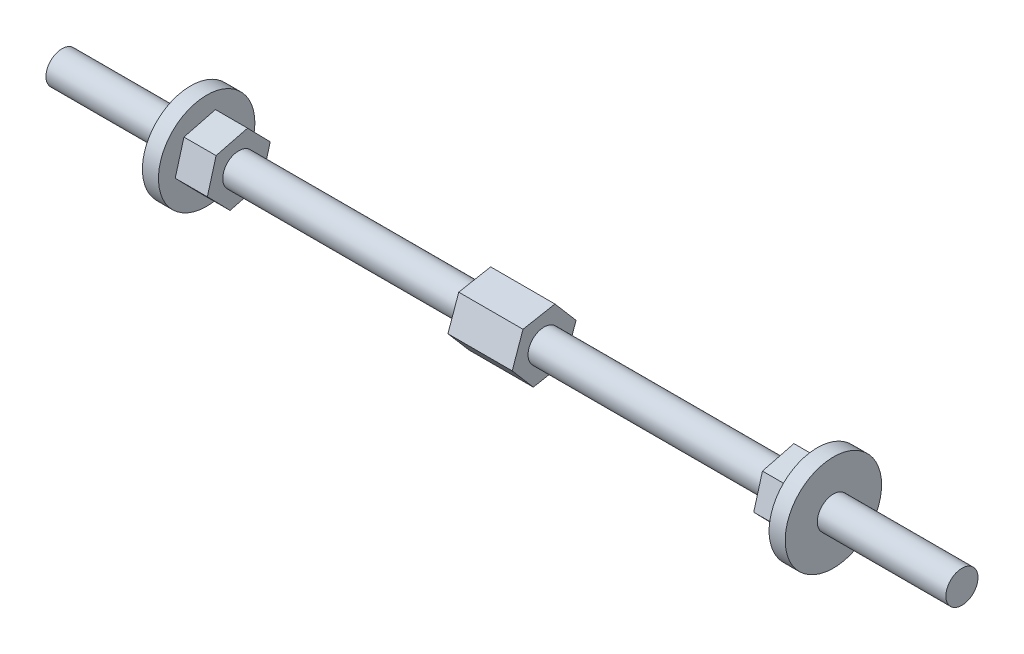
ISO-10303-21;
HEADER;
FILE_DESCRIPTION(('STEP AP214'),'2;1');
FILE_NAME('part.step','',(''),(''),'','','');
FILE_SCHEMA(('AUTOMOTIVE_DESIGN { 1 0 10303 214 1 1 1 1 }'));
ENDSEC;
DATA;
#1=APPLICATION_CONTEXT('core data for automotive mechanical design processes');
#2=APPLICATION_PROTOCOL_DEFINITION('international standard','automotive_design',2000,#1);
#3=PRODUCT_CONTEXT('',#1,'mechanical');
#4=PRODUCT('Part','Part','',(#3));
#5=PRODUCT_RELATED_PRODUCT_CATEGORY('part','',(#4));
#6=PRODUCT_DEFINITION_FORMATION('','',#4);
#7=PRODUCT_DEFINITION_CONTEXT('part definition',#1,'design');
#8=PRODUCT_DEFINITION('design','',#6,#7);
#9=PRODUCT_DEFINITION_SHAPE('','',#8);
#10=(LENGTH_UNIT() NAMED_UNIT(*) SI_UNIT(.MILLI.,.METRE.));
#11=(NAMED_UNIT(*) PLANE_ANGLE_UNIT() SI_UNIT($,.RADIAN.));
#12=(NAMED_UNIT(*) SI_UNIT($,.STERADIAN.) SOLID_ANGLE_UNIT());
#13=UNCERTAINTY_MEASURE_WITH_UNIT(LENGTH_MEASURE(1.E-05),#10,'distance_accuracy_value','');
#14=(GEOMETRIC_REPRESENTATION_CONTEXT(3) GLOBAL_UNCERTAINTY_ASSIGNED_CONTEXT((#13)) GLOBAL_UNIT_ASSIGNED_CONTEXT((#10,
#11,#12)) REPRESENTATION_CONTEXT('',''));
#15=CARTESIAN_POINT('',(0.,0.,0.));
#16=DIRECTION('',(0.,0.,1.));
#17=DIRECTION('',(1.,0.,0.));
#18=AXIS2_PLACEMENT_3D('',#15,#16,#17);
#19=CARTESIAN_POINT('',(-6.35,-6.0497679994844,2.13608502540229));
#20=DIRECTION('',(0.,-0.983087144735073,-0.183138378983327));
#21=DIRECTION('',(0.,0.183138378983327,-0.983087144735074));
#22=AXIS2_PLACEMENT_3D('',#19,#20,#21);
#23=PLANE('',#22);
#24=DIRECTION('',(1.,0.,0.));
#25=VECTOR('',#24,1.);
#26=CARTESIAN_POINT('',(-6.35,-4.87478789638411,-4.17121026185451));
#27=LINE('',#26,#25);
#28=CARTESIAN_POINT('',(-6.35,-4.87478789638411,-4.17121026185451));
#29=VERTEX_POINT('',#28);
#30=CARTESIAN_POINT('',(6.35,-4.87478789638411,-4.17121026185451));
#31=VERTEX_POINT('',#30);
#32=EDGE_CURVE('E381',#29,#31,#27,.T.);
#33=ORIENTED_EDGE('',*,*,#32,.T.);
#34=DIRECTION('',(0.,0.183138378983327,-0.983087144735073));
#35=VECTOR('',#34,1.);
#36=CARTESIAN_POINT('',(6.35,-6.0497679994844,2.13608502540229));
#37=LINE('',#36,#35);
#38=CARTESIAN_POINT('',(6.35,-6.0497679994844,2.13608502540229));
#39=VERTEX_POINT('',#38);
#40=EDGE_CURVE('E336',#39,#31,#37,.T.);
#41=ORIENTED_EDGE('',*,*,#40,.F.);
#42=DIRECTION('',(1.,0.,0.));
#43=VECTOR('',#42,1.);
#44=CARTESIAN_POINT('',(-6.35,-6.0497679994844,2.13608502540229));
#45=LINE('',#44,#43);
#46=CARTESIAN_POINT('',(-6.35,-6.0497679994844,2.13608502540229));
#47=VERTEX_POINT('',#46);
#48=EDGE_CURVE('E57',#47,#39,#45,.T.);
#49=ORIENTED_EDGE('',*,*,#48,.F.);
#50=DIRECTION('',(0.,0.183138378983327,-0.983087144735073));
#51=VECTOR('',#50,1.);
#52=CARTESIAN_POINT('',(-6.35,-6.0497679994844,2.13608502540229));
#53=LINE('',#52,#51);
#54=EDGE_CURVE('E360',#47,#29,#53,.T.);
#55=ORIENTED_EDGE('',*,*,#54,.T.);
#56=EDGE_LOOP('',(#33,#41,#49,#55));
#57=FACE_BOUND('',#56,.T.);
#58=ADVANCED_FACE('F41',(#57),#23,.T.);
#59=CARTESIAN_POINT('',(-6.35,-1.17498010310029,6.30729528725679));
#60=DIRECTION('',(0.,-0.650146060975,0.759809251982819));
#61=DIRECTION('',(0.,-0.759809251982819,-0.650146060975));
#62=AXIS2_PLACEMENT_3D('',#59,#60,#61);
#63=PLANE('',#62);
#64=ORIENTED_EDGE('',*,*,#48,.T.);
#65=DIRECTION('',(0.,-0.759809251982819,-0.650146060975));
#66=VECTOR('',#65,1.);
#67=CARTESIAN_POINT('',(6.35,-1.17498010310029,6.30729528725679));
#68=LINE('',#67,#66);
#69=CARTESIAN_POINT('',(6.35,-1.17498010310029,6.30729528725679));
#70=VERTEX_POINT('',#69);
#71=EDGE_CURVE('E356',#70,#39,#68,.T.);
#72=ORIENTED_EDGE('',*,*,#71,.F.);
#73=DIRECTION('',(1.,0.,0.));
#74=VECTOR('',#73,1.);
#75=CARTESIAN_POINT('',(-6.35,-1.17498010310029,6.30729528725679));
#76=LINE('',#75,#74);
#77=CARTESIAN_POINT('',(-6.35,-1.17498010310029,6.30729528725679));
#78=VERTEX_POINT('',#77);
#79=EDGE_CURVE('E65',#78,#70,#76,.T.);
#80=ORIENTED_EDGE('',*,*,#79,.F.);
#81=DIRECTION('',(0.,-0.759809251982819,-0.650146060975));
#82=VECTOR('',#81,1.);
#83=CARTESIAN_POINT('',(-6.35,-1.17498010310029,6.30729528725679));
#84=LINE('',#83,#82);
#85=EDGE_CURVE('E378',#78,#47,#84,.T.);
#86=ORIENTED_EDGE('',*,*,#85,.T.);
#87=EDGE_LOOP('',(#64,#72,#80,#86));
#88=FACE_BOUND('',#87,.T.);
#89=ADVANCED_FACE('F403',(#88),#63,.T.);
#90=CARTESIAN_POINT('',(-6.35,4.87478789638411,4.17121026185451));
#91=DIRECTION('',(0.,0.332941083760074,0.942947630966146));
#92=DIRECTION('',(0.,-0.942947630966146,0.332941083760074));
#93=AXIS2_PLACEMENT_3D('',#90,#91,#92);
#94=PLANE('',#93);
#95=ORIENTED_EDGE('',*,*,#79,.T.);
#96=DIRECTION('',(0.,-0.942947630966146,0.332941083760074));
#97=VECTOR('',#96,1.);
#98=CARTESIAN_POINT('',(6.35,4.87478789638411,4.17121026185451));
#99=LINE('',#98,#97);
#100=CARTESIAN_POINT('',(6.35,4.87478789638411,4.17121026185451));
#101=VERTEX_POINT('',#100);
#102=EDGE_CURVE('E352',#101,#70,#99,.T.);
#103=ORIENTED_EDGE('',*,*,#102,.F.);
#104=DIRECTION('',(1.,0.,0.));
#105=VECTOR('',#104,1.);
#106=CARTESIAN_POINT('',(-6.35,4.87478789638411,4.17121026185451));
#107=LINE('',#106,#105);
#108=CARTESIAN_POINT('',(-6.35,4.87478789638411,4.17121026185451));
#109=VERTEX_POINT('',#108);
#110=EDGE_CURVE('E386',#109,#101,#107,.T.);
#111=ORIENTED_EDGE('',*,*,#110,.F.);
#112=DIRECTION('',(0.,-0.942947630966146,0.332941083760074));
#113=VECTOR('',#112,1.);
#114=CARTESIAN_POINT('',(-6.35,4.87478789638411,4.17121026185451));
#115=LINE('',#114,#113);
#116=EDGE_CURVE('E375',#109,#78,#115,.T.);
#117=ORIENTED_EDGE('',*,*,#116,.T.);
#118=EDGE_LOOP('',(#95,#103,#111,#117));
#119=FACE_BOUND('',#118,.T.);
#120=ADVANCED_FACE('F416',(#119),#94,.T.);
#121=CARTESIAN_POINT('',(-6.35,6.0497679994844,-2.13608502540229));
#122=DIRECTION('',(0.,0.983087144735074,0.183138378983327));
#123=DIRECTION('',(0.,-0.183138378983327,0.983087144735074));
#124=AXIS2_PLACEMENT_3D('',#121,#122,#123);
#125=PLANE('',#124);
#126=ORIENTED_EDGE('',*,*,#110,.T.);
#127=DIRECTION('',(0.,-0.183138378983327,0.983087144735074));
#128=VECTOR('',#127,1.);
#129=CARTESIAN_POINT('',(6.35,6.0497679994844,-2.13608502540229));
#130=LINE('',#129,#128);
#131=CARTESIAN_POINT('',(6.35,6.0497679994844,-2.13608502540229));
#132=VERTEX_POINT('',#131);
#133=EDGE_CURVE('E348',#132,#101,#130,.T.);
#134=ORIENTED_EDGE('',*,*,#133,.F.);
#135=DIRECTION('',(1.,0.,0.));
#136=VECTOR('',#135,1.);
#137=CARTESIAN_POINT('',(-6.35,6.0497679994844,-2.13608502540229));
#138=LINE('',#137,#136);
#139=CARTESIAN_POINT('',(-6.35,6.0497679994844,-2.13608502540229));
#140=VERTEX_POINT('',#139);
#141=EDGE_CURVE('E389',#140,#132,#138,.T.);
#142=ORIENTED_EDGE('',*,*,#141,.F.);
#143=DIRECTION('',(0.,-0.183138378983327,0.983087144735074));
#144=VECTOR('',#143,1.);
#145=CARTESIAN_POINT('',(-6.35,6.0497679994844,-2.13608502540229));
#146=LINE('',#145,#144);
#147=EDGE_CURVE('E371',#140,#109,#146,.T.);
#148=ORIENTED_EDGE('',*,*,#147,.T.);
#149=EDGE_LOOP('',(#126,#134,#142,#148));
#150=FACE_BOUND('',#149,.T.);
#151=ADVANCED_FACE('F414',(#150),#125,.T.);
#152=CARTESIAN_POINT('',(-6.35,1.17498010310029,-6.30729528725679));
#153=DIRECTION('',(0.,0.650146060975,-0.759809251982819));
#154=DIRECTION('',(0.,0.759809251982819,0.650146060975));
#155=AXIS2_PLACEMENT_3D('',#152,#153,#154);
#156=PLANE('',#155);
#157=ORIENTED_EDGE('',*,*,#141,.T.);
#158=DIRECTION('',(0.,0.759809251982819,0.650146060975));
#159=VECTOR('',#158,1.);
#160=CARTESIAN_POINT('',(6.35,1.17498010310029,-6.30729528725679));
#161=LINE('',#160,#159);
#162=CARTESIAN_POINT('',(6.35,1.17498010310029,-6.30729528725679));
#163=VERTEX_POINT('',#162);
#164=EDGE_CURVE('E344',#163,#132,#161,.T.);
#165=ORIENTED_EDGE('',*,*,#164,.F.);
#166=DIRECTION('',(1.,0.,0.));
#167=VECTOR('',#166,1.);
#168=CARTESIAN_POINT('',(-6.35,1.17498010310029,-6.30729528725679));
#169=LINE('',#168,#167);
#170=CARTESIAN_POINT('',(-6.35,1.17498010310029,-6.30729528725679));
#171=VERTEX_POINT('',#170);
#172=EDGE_CURVE('E392',#171,#163,#169,.T.);
#173=ORIENTED_EDGE('',*,*,#172,.F.);
#174=DIRECTION('',(0.,0.759809251982819,0.650146060975));
#175=VECTOR('',#174,1.);
#176=CARTESIAN_POINT('',(-6.35,1.17498010310029,-6.30729528725679));
#177=LINE('',#176,#175);
#178=EDGE_CURVE('E367',#171,#140,#177,.T.);
#179=ORIENTED_EDGE('',*,*,#178,.T.);
#180=EDGE_LOOP('',(#157,#165,#173,#179));
#181=FACE_BOUND('',#180,.T.);
#182=ADVANCED_FACE('F411',(#181),#156,.T.);
#183=CARTESIAN_POINT('',(-6.35,-4.87478789638411,-4.17121026185451));
#184=DIRECTION('',(0.,-0.332941083760073,-0.942947630966146));
#185=DIRECTION('',(0.,0.942947630966146,-0.332941083760074));
#186=AXIS2_PLACEMENT_3D('',#183,#184,#185);
#187=PLANE('',#186);
#188=ORIENTED_EDGE('',*,*,#172,.T.);
#189=DIRECTION('',(0.,0.942947630966146,-0.332941083760073));
#190=VECTOR('',#189,1.);
#191=CARTESIAN_POINT('',(6.35,-4.87478789638411,-4.17121026185451));
#192=LINE('',#191,#190);
#193=EDGE_CURVE('E340',#31,#163,#192,.T.);
#194=ORIENTED_EDGE('',*,*,#193,.F.);
#195=ORIENTED_EDGE('',*,*,#32,.F.);
#196=DIRECTION('',(0.,0.942947630966146,-0.332941083760073));
#197=VECTOR('',#196,1.);
#198=CARTESIAN_POINT('',(-6.35,-4.87478789638411,-4.17121026185451));
#199=LINE('',#198,#197);
#200=EDGE_CURVE('E363',#29,#171,#199,.T.);
#201=ORIENTED_EDGE('',*,*,#200,.T.);
#202=EDGE_LOOP('',(#188,#194,#195,#201));
#203=FACE_BOUND('',#202,.T.);
#204=ADVANCED_FACE('F398',(#203),#187,.T.);
#205=CARTESIAN_POINT('',(-6.35,0.,0.));
#206=DIRECTION('',(1.,0.,0.));
#207=DIRECTION('',(0.,0.,-1.));
#208=AXIS2_PLACEMENT_3D('',#205,#206,#207);
#209=PLANE('',#208);
#210=CARTESIAN_POINT('',(-6.35,0.,0.));
#211=DIRECTION('',(1.,0.,0.));
#212=DIRECTION('',(0.,0.,-1.));
#213=AXIS2_PLACEMENT_3D('',#210,#211,#212);
#214=CIRCLE('',#213,3.175);
#215=CARTESIAN_POINT('',(-6.35,0.,-3.175));
#216=VERTEX_POINT('',#215);
#217=EDGE_CURVE('E329',#216,#216,#214,.T.);
#218=ORIENTED_EDGE('',*,*,#217,.T.);
#219=EDGE_LOOP('',(#218));
#220=FACE_BOUND('',#219,.T.);
#221=ORIENTED_EDGE('',*,*,#54,.F.);
#222=ORIENTED_EDGE('',*,*,#85,.F.);
#223=ORIENTED_EDGE('',*,*,#116,.F.);
#224=ORIENTED_EDGE('',*,*,#147,.F.);
#225=ORIENTED_EDGE('',*,*,#178,.F.);
#226=ORIENTED_EDGE('',*,*,#200,.F.);
#227=EDGE_LOOP('',(#221,#222,#223,#224,#225,#226));
#228=FACE_BOUND('',#227,.T.);
#229=ADVANCED_FACE('F407',(#220,#228),#209,.F.);
#230=CARTESIAN_POINT('',(6.35,0.,0.));
#231=DIRECTION('',(1.,0.,0.));
#232=DIRECTION('',(0.,0.,-1.));
#233=AXIS2_PLACEMENT_3D('',#230,#231,#232);
#234=PLANE('',#233);
#235=CARTESIAN_POINT('',(6.35,0.,0.));
#236=DIRECTION('',(1.,0.,0.));
#237=DIRECTION('',(0.,0.,-1.));
#238=AXIS2_PLACEMENT_3D('',#235,#236,#237);
#239=CIRCLE('',#238,3.175);
#240=CARTESIAN_POINT('',(6.35,0.,-3.175));
#241=VERTEX_POINT('',#240);
#242=EDGE_CURVE('E44',#241,#241,#239,.T.);
#243=ORIENTED_EDGE('',*,*,#242,.F.);
#244=EDGE_LOOP('',(#243));
#245=FACE_BOUND('',#244,.T.);
#246=ORIENTED_EDGE('',*,*,#40,.T.);
#247=ORIENTED_EDGE('',*,*,#193,.T.);
#248=ORIENTED_EDGE('',*,*,#164,.T.);
#249=ORIENTED_EDGE('',*,*,#133,.T.);
#250=ORIENTED_EDGE('',*,*,#102,.T.);
#251=ORIENTED_EDGE('',*,*,#71,.T.);
#252=EDGE_LOOP('',(#246,#247,#248,#249,#250,#251));
#253=FACE_BOUND('',#252,.T.);
#254=ADVANCED_FACE('F401',(#245,#253),#234,.T.);
#255=CARTESIAN_POINT('',(-53.975,0.,0.));
#256=DIRECTION('',(1.,0.,0.));
#257=DIRECTION('',(0.,0.,-1.));
#258=AXIS2_PLACEMENT_3D('',#255,#256,#257);
#259=CYLINDRICAL_SURFACE('',#258,3.175);
#260=CARTESIAN_POINT('',(53.975,0.,0.));
#261=DIRECTION('',(1.,0.,0.));
#262=DIRECTION('',(0.,0.,-1.));
#263=AXIS2_PLACEMENT_3D('',#260,#261,#262);
#264=CIRCLE('',#263,3.175);
#265=CARTESIAN_POINT('',(53.975,0.,-3.175));
#266=VERTEX_POINT('',#265);
#267=EDGE_CURVE('E325',#266,#266,#264,.T.);
#268=CARTESIAN_POINT('',(6.35,0.,-3.175));
#269=CARTESIAN_POINT('',(6.84609375,0.,-3.175));
#270=CARTESIAN_POINT('',(7.3421875,0.,-3.175));
#271=CARTESIAN_POINT('',(8.334375,0.,-3.175));
#272=CARTESIAN_POINT('',(8.83046875,0.,-3.175));
#273=CARTESIAN_POINT('',(9.82265625,0.,-3.175));
#274=CARTESIAN_POINT('',(10.31875,0.,-3.175));
#275=CARTESIAN_POINT('',(11.3109375,0.,-3.175));
#276=CARTESIAN_POINT('',(11.80703125,0.,-3.175));
#277=CARTESIAN_POINT('',(12.79921875,0.,-3.175));
#278=CARTESIAN_POINT('',(13.2953125,0.,-3.175));
#279=CARTESIAN_POINT('',(14.2875,0.,-3.175));
#280=CARTESIAN_POINT('',(14.78359375,0.,-3.175));
#281=CARTESIAN_POINT('',(15.77578125,0.,-3.175));
#282=CARTESIAN_POINT('',(16.271875,0.,-3.175));
#283=CARTESIAN_POINT('',(17.2640625,0.,-3.175));
#284=CARTESIAN_POINT('',(17.76015625,0.,-3.175));
#285=CARTESIAN_POINT('',(18.75234375,0.,-3.175));
#286=CARTESIAN_POINT('',(19.2484375,0.,-3.175));
#287=CARTESIAN_POINT('',(20.240625,0.,-3.175));
#288=CARTESIAN_POINT('',(20.73671875,0.,-3.175));
#289=CARTESIAN_POINT('',(21.72890625,0.,-3.175));
#290=CARTESIAN_POINT('',(22.225,0.,-3.175));
#291=CARTESIAN_POINT('',(23.2171875,0.,-3.175));
#292=CARTESIAN_POINT('',(23.71328125,0.,-3.175));
#293=CARTESIAN_POINT('',(24.70546875,0.,-3.175));
#294=CARTESIAN_POINT('',(25.2015625,0.,-3.175));
#295=CARTESIAN_POINT('',(26.19375,0.,-3.175));
#296=CARTESIAN_POINT('',(26.68984375,0.,-3.175));
#297=CARTESIAN_POINT('',(27.68203125,0.,-3.175));
#298=CARTESIAN_POINT('',(28.178125,0.,-3.175));
#299=CARTESIAN_POINT('',(29.1703125,0.,-3.175));
#300=CARTESIAN_POINT('',(29.66640625,0.,-3.175));
#301=CARTESIAN_POINT('',(30.65859375,0.,-3.175));
#302=CARTESIAN_POINT('',(31.1546875,0.,-3.175));
#303=CARTESIAN_POINT('',(32.146875,0.,-3.175));
#304=CARTESIAN_POINT('',(32.64296875,0.,-3.175));
#305=CARTESIAN_POINT('',(33.63515625,0.,-3.175));
#306=CARTESIAN_POINT('',(34.13125,0.,-3.175));
#307=CARTESIAN_POINT('',(35.1234375,0.,-3.175));
#308=CARTESIAN_POINT('',(35.61953125,0.,-3.175));
#309=CARTESIAN_POINT('',(36.61171875,0.,-3.175));
#310=CARTESIAN_POINT('',(37.1078125,0.,-3.175));
#311=CARTESIAN_POINT('',(38.1,0.,-3.175));
#312=CARTESIAN_POINT('',(38.59609375,0.,-3.175));
#313=CARTESIAN_POINT('',(39.58828125,0.,-3.175));
#314=CARTESIAN_POINT('',(40.084375,0.,-3.175));
#315=CARTESIAN_POINT('',(41.0765625,0.,-3.175));
#316=CARTESIAN_POINT('',(41.57265625,0.,-3.175));
#317=CARTESIAN_POINT('',(42.56484375,0.,-3.175));
#318=CARTESIAN_POINT('',(43.0609375,0.,-3.175));
#319=CARTESIAN_POINT('',(44.053125,0.,-3.175));
#320=CARTESIAN_POINT('',(44.54921875,0.,-3.175));
#321=CARTESIAN_POINT('',(45.54140625,0.,-3.175));
#322=CARTESIAN_POINT('',(46.0375,0.,-3.175));
#323=CARTESIAN_POINT('',(47.0296875,0.,-3.175));
#324=CARTESIAN_POINT('',(47.52578125,0.,-3.175));
#325=CARTESIAN_POINT('',(48.51796875,0.,-3.175));
#326=CARTESIAN_POINT('',(49.0140625,0.,-3.175));
#327=CARTESIAN_POINT('',(50.00625,0.,-3.175));
#328=CARTESIAN_POINT('',(50.50234375,0.,-3.175));
#329=CARTESIAN_POINT('',(51.49453125,0.,-3.175));
#330=CARTESIAN_POINT('',(51.990625,0.,-3.175));
#331=CARTESIAN_POINT('',(52.9828125,0.,-3.175));
#332=CARTESIAN_POINT('',(53.47890625,0.,-3.175));
#333=CARTESIAN_POINT('',(53.975,0.,-3.175));
#334=B_SPLINE_CURVE_WITH_KNOTS('',3,(#268,#269,#270,#271,#272,#273,#274,#275,#276,#277,#278,
#279,#280,#281,#282,#283,#284,#285,#286,#287,#288,#289,#290,#291,#292,#293,#294,#295,#296,#297,
#298,#299,#300,#301,#302,#303,#304,#305,#306,#307,#308,#309,#310,#311,#312,#313,#314,#315,#316,
#317,#318,#319,#320,#321,#322,#323,#324,#325,#326,#327,#328,#329,#330,#331,#332,#333),
.UNSPECIFIED.,.F.,.F.,(4,2,2,2,2,2,2,2,2,2,2,2,2,2,2,2,2,2,2,2,2,2,2,2,2,2,2,2,2,2,2,2,4),(0.,
1.48828125,2.97656249999999,4.46484375,5.953125,7.44140625,8.9296875,10.41796875,11.90625,
13.39453125,14.8828125,16.37109375,17.859375,19.34765625,20.8359375,22.32421875,23.8125,
25.30078125,26.7890625,28.27734375,29.765625,31.25390625,32.7421875,34.23046875,35.71875,
37.20703125,38.6953125,40.18359375,41.671875,43.16015625,44.6484375,46.13671875,47.625),.UNSPECIFIED.);
#335=EDGE_CURVE('BSEAM475',#241,#266,#334,.T.);
#336=ORIENTED_EDGE('',*,*,#242,.T.);
#337=ORIENTED_EDGE('',*,*,#267,.F.);
#338=ORIENTED_EDGE('',*,*,#335,.T.);
#339=ORIENTED_EDGE('',*,*,#335,.F.);
#340=EDGE_LOOP('',(#336,#338,#337,#339));
#341=FACE_BOUND('',#340,.T.);
#342=ADVANCED_FACE('F475',(#341),#259,.T.);
#343=CARTESIAN_POINT('',(-53.975,0.,0.));
#344=DIRECTION('',(1.,0.,0.));
#345=DIRECTION('',(0.,0.,-1.));
#346=AXIS2_PLACEMENT_3D('',#343,#344,#345);
#347=CIRCLE('',#346,3.175);
#348=CARTESIAN_POINT('',(-53.975,0.,-3.175));
#349=VERTEX_POINT('',#348);
#350=EDGE_CURVE('E249',#349,#349,#347,.T.);
#351=CARTESIAN_POINT('',(-53.975,0.,-3.175));
#352=CARTESIAN_POINT('',(-53.47890625,0.,-3.175));
#353=CARTESIAN_POINT('',(-52.9828125,0.,-3.175));
#354=CARTESIAN_POINT('',(-51.990625,0.,-3.175));
#355=CARTESIAN_POINT('',(-51.49453125,0.,-3.175));
#356=CARTESIAN_POINT('',(-50.50234375,0.,-3.175));
#357=CARTESIAN_POINT('',(-50.00625,0.,-3.175));
#358=CARTESIAN_POINT('',(-49.0140625,0.,-3.175));
#359=CARTESIAN_POINT('',(-48.51796875,0.,-3.175));
#360=CARTESIAN_POINT('',(-47.52578125,0.,-3.175));
#361=CARTESIAN_POINT('',(-47.0296875,0.,-3.175));
#362=CARTESIAN_POINT('',(-46.0375,0.,-3.175));
#363=CARTESIAN_POINT('',(-45.54140625,0.,-3.175));
#364=CARTESIAN_POINT('',(-44.54921875,0.,-3.175));
#365=CARTESIAN_POINT('',(-44.053125,0.,-3.175));
#366=CARTESIAN_POINT('',(-43.0609375,0.,-3.175));
#367=CARTESIAN_POINT('',(-42.56484375,0.,-3.175));
#368=CARTESIAN_POINT('',(-41.57265625,0.,-3.175));
#369=CARTESIAN_POINT('',(-41.0765625,0.,-3.175));
#370=CARTESIAN_POINT('',(-40.084375,0.,-3.175));
#371=CARTESIAN_POINT('',(-39.58828125,0.,-3.175));
#372=CARTESIAN_POINT('',(-38.59609375,0.,-3.175));
#373=CARTESIAN_POINT('',(-38.1,0.,-3.175));
#374=CARTESIAN_POINT('',(-37.1078125,0.,-3.175));
#375=CARTESIAN_POINT('',(-36.61171875,0.,-3.175));
#376=CARTESIAN_POINT('',(-35.61953125,0.,-3.175));
#377=CARTESIAN_POINT('',(-35.1234375,0.,-3.175));
#378=CARTESIAN_POINT('',(-34.13125,0.,-3.175));
#379=CARTESIAN_POINT('',(-33.63515625,0.,-3.175));
#380=CARTESIAN_POINT('',(-32.64296875,0.,-3.175));
#381=CARTESIAN_POINT('',(-32.146875,0.,-3.175));
#382=CARTESIAN_POINT('',(-31.1546875,0.,-3.175));
#383=CARTESIAN_POINT('',(-30.65859375,0.,-3.175));
#384=CARTESIAN_POINT('',(-29.66640625,0.,-3.175));
#385=CARTESIAN_POINT('',(-29.1703125,0.,-3.175));
#386=CARTESIAN_POINT('',(-28.178125,0.,-3.175));
#387=CARTESIAN_POINT('',(-27.68203125,0.,-3.175));
#388=CARTESIAN_POINT('',(-26.68984375,0.,-3.175));
#389=CARTESIAN_POINT('',(-26.19375,0.,-3.175));
#390=CARTESIAN_POINT('',(-25.2015625,0.,-3.175));
#391=CARTESIAN_POINT('',(-24.70546875,0.,-3.175));
#392=CARTESIAN_POINT('',(-23.71328125,0.,-3.175));
#393=CARTESIAN_POINT('',(-23.2171875,0.,-3.175));
#394=CARTESIAN_POINT('',(-22.225,0.,-3.175));
#395=CARTESIAN_POINT('',(-21.72890625,0.,-3.175));
#396=CARTESIAN_POINT('',(-20.73671875,0.,-3.175));
#397=CARTESIAN_POINT('',(-20.240625,0.,-3.175));
#398=CARTESIAN_POINT('',(-19.2484375,0.,-3.175));
#399=CARTESIAN_POINT('',(-18.75234375,0.,-3.175));
#400=CARTESIAN_POINT('',(-17.76015625,0.,-3.175));
#401=CARTESIAN_POINT('',(-17.2640625,0.,-3.175));
#402=CARTESIAN_POINT('',(-16.271875,0.,-3.175));
#403=CARTESIAN_POINT('',(-15.77578125,0.,-3.175));
#404=CARTESIAN_POINT('',(-14.78359375,0.,-3.175));
#405=CARTESIAN_POINT('',(-14.2875,0.,-3.175));
#406=CARTESIAN_POINT('',(-13.2953125,0.,-3.175));
#407=CARTESIAN_POINT('',(-12.79921875,0.,-3.175));
#408=CARTESIAN_POINT('',(-11.80703125,0.,-3.175));
#409=CARTESIAN_POINT('',(-11.3109375,0.,-3.175));
#410=CARTESIAN_POINT('',(-10.31875,0.,-3.175));
#411=CARTESIAN_POINT('',(-9.82265625,0.,-3.175));
#412=CARTESIAN_POINT('',(-8.83046875,0.,-3.175));
#413=CARTESIAN_POINT('',(-8.334375,0.,-3.175));
#414=CARTESIAN_POINT('',(-7.3421875,0.,-3.175));
#415=CARTESIAN_POINT('',(-6.84609375,0.,-3.175));
#416=CARTESIAN_POINT('',(-6.35,0.,-3.175));
#417=B_SPLINE_CURVE_WITH_KNOTS('',3,(#351,#352,#353,#354,#355,#356,#357,#358,#359,#360,#361,
#362,#363,#364,#365,#366,#367,#368,#369,#370,#371,#372,#373,#374,#375,#376,#377,#378,#379,#380,
#381,#382,#383,#384,#385,#386,#387,#388,#389,#390,#391,#392,#393,#394,#395,#396,#397,#398,#399,
#400,#401,#402,#403,#404,#405,#406,#407,#408,#409,#410,#411,#412,#413,#414,#415,#416),
.UNSPECIFIED.,.F.,.F.,(4,2,2,2,2,2,2,2,2,2,2,2,2,2,2,2,2,2,2,2,2,2,2,2,2,2,2,2,2,2,2,2,4),(0.,
1.48828124999999,2.97656249999999,4.46484375,5.953125,7.44140625,8.92968749999999,10.41796875,
11.90625,13.39453125,14.8828125,16.37109375,17.859375,19.34765625,20.8359375,22.32421875,
23.8125,25.30078125,26.7890625,28.27734375,29.765625,31.25390625,32.7421875,34.23046875,
35.71875,37.20703125,38.6953125,40.18359375,41.671875,43.16015625,44.6484375,46.13671875,
47.625),.UNSPECIFIED.);
#418=EDGE_CURVE('BSEAM486',#349,#216,#417,.T.);
#419=ORIENTED_EDGE('',*,*,#350,.T.);
#420=ORIENTED_EDGE('',*,*,#217,.F.);
#421=ORIENTED_EDGE('',*,*,#418,.T.);
#422=ORIENTED_EDGE('',*,*,#418,.F.);
#423=EDGE_LOOP('',(#419,#421,#420,#422));
#424=FACE_BOUND('',#423,.T.);
#425=ADVANCED_FACE('F486',(#424),#259,.T.);
#426=CARTESIAN_POINT('',(60.325,-6.17917672834168,1.72636237309958));
#427=DIRECTION('',(0.,0.968624410686555,0.248529175394207));
#428=DIRECTION('',(0.,-0.248529175394207,0.968624410686555));
#429=AXIS2_PLACEMENT_3D('',#426,#427,#428);
#430=PLANE('',#429);
#431=DIRECTION('',(0.,0.248529175394207,-0.968624410686555));
#432=VECTOR('',#431,1.);
#433=CARTESIAN_POINT('',(53.975,-6.17917672834168,1.72636237309958));
#434=LINE('',#433,#432);
#435=CARTESIAN_POINT('',(53.975,-6.17917672834168,1.72636237309958));
#436=VERTEX_POINT('',#435);
#437=CARTESIAN_POINT('',(53.975,-4.58466203541267,-4.48814283466771));
#438=VERTEX_POINT('',#437);
#439=EDGE_CURVE('E254',#436,#438,#434,.T.);
#440=ORIENTED_EDGE('',*,*,#439,.T.);
#441=DIRECTION('',(-1.,0.,0.));
#442=VECTOR('',#441,1.);
#443=CARTESIAN_POINT('',(60.325,-4.58466203541267,-4.48814283466771));
#444=LINE('',#443,#442);
#445=CARTESIAN_POINT('',(60.325,-4.58466203541267,-4.48814283466771));
#446=VERTEX_POINT('',#445);
#447=EDGE_CURVE('E321',#446,#438,#444,.T.);
#448=ORIENTED_EDGE('',*,*,#447,.F.);
#449=DIRECTION('',(0.,0.248529175394207,-0.968624410686555));
#450=VECTOR('',#449,1.);
#451=CARTESIAN_POINT('',(60.325,-6.17917672834168,1.72636237309958));
#452=LINE('',#451,#450);
#453=CARTESIAN_POINT('',(60.325,-6.17917672834168,1.72636237309958));
#454=VERTEX_POINT('',#453);
#455=EDGE_CURVE('E259',#454,#446,#452,.T.);
#456=ORIENTED_EDGE('',*,*,#455,.F.);
#457=DIRECTION('',(-1.,0.,0.));
#458=VECTOR('',#457,1.);
#459=CARTESIAN_POINT('',(60.325,-6.17917672834168,1.72636237309958));
#460=LINE('',#459,#458);
#461=EDGE_CURVE('E284',#454,#436,#460,.T.);
#462=ORIENTED_EDGE('',*,*,#461,.T.);
#463=EDGE_LOOP('',(#440,#448,#456,#462));
#464=FACE_BOUND('',#463,.T.);
#465=ADVANCED_FACE('F498',(#464),#430,.F.);
#466=CARTESIAN_POINT('',(60.325,-4.58466203541267,-4.48814283466771));
#467=DIRECTION('',(0.,0.269079625870295,0.963117934077391));
#468=DIRECTION('',(0.,-0.963117934077391,0.269079625870295));
#469=AXIS2_PLACEMENT_3D('',#466,#467,#468);
#470=PLANE('',#469);
#471=DIRECTION('',(0.,0.963117934077391,-0.269079625870295));
#472=VECTOR('',#471,1.);
#473=CARTESIAN_POINT('',(53.975,-4.58466203541267,-4.48814283466771));
#474=LINE('',#473,#472);
#475=CARTESIAN_POINT('',(53.975,1.59451469292901,-6.21450520776729));
#476=VERTEX_POINT('',#475);
#477=EDGE_CURVE('E288',#438,#476,#474,.T.);
#478=ORIENTED_EDGE('',*,*,#477,.T.);
#479=DIRECTION('',(-1.,0.,0.));
#480=VECTOR('',#479,1.);
#481=CARTESIAN_POINT('',(60.325,1.59451469292901,-6.21450520776729));
#482=LINE('',#481,#480);
#483=CARTESIAN_POINT('',(60.325,1.59451469292901,-6.21450520776729));
#484=VERTEX_POINT('',#483);
#485=EDGE_CURVE('E317',#484,#476,#482,.T.);
#486=ORIENTED_EDGE('',*,*,#485,.F.);
#487=DIRECTION('',(0.,0.963117934077391,-0.269079625870295));
#488=VECTOR('',#487,1.);
#489=CARTESIAN_POINT('',(60.325,-4.58466203541267,-4.48814283466771));
#490=LINE('',#489,#488);
#491=EDGE_CURVE('E263',#446,#484,#490,.T.);
#492=ORIENTED_EDGE('',*,*,#491,.F.);
#493=ORIENTED_EDGE('',*,*,#447,.T.);
#494=EDGE_LOOP('',(#478,#486,#492,#493));
#495=FACE_BOUND('',#494,.T.);
#496=ADVANCED_FACE('F523',(#495),#470,.F.);
#497=CARTESIAN_POINT('',(60.325,1.59451469292901,-6.21450520776729));
#498=DIRECTION('',(0.,-0.699544784816259,0.714588758683184));
#499=DIRECTION('',(0.,-0.714588758683184,-0.699544784816259));
#500=AXIS2_PLACEMENT_3D('',#497,#498,#499);
#501=PLANE('',#500);
#502=DIRECTION('',(0.,0.714588758683184,0.699544784816259));
#503=VECTOR('',#502,1.);
#504=CARTESIAN_POINT('',(53.975,1.59451469292901,-6.21450520776729));
#505=LINE('',#504,#503);
#506=CARTESIAN_POINT('',(53.975,6.17917672834167,-1.72636237309958));
#507=VERTEX_POINT('',#506);
#508=EDGE_CURVE('E291',#476,#507,#505,.T.);
#509=ORIENTED_EDGE('',*,*,#508,.T.);
#510=DIRECTION('',(-1.,0.,0.));
#511=VECTOR('',#510,1.);
#512=CARTESIAN_POINT('',(60.325,6.17917672834167,-1.72636237309958));
#513=LINE('',#512,#511);
#514=CARTESIAN_POINT('',(60.325,6.17917672834167,-1.72636237309958));
#515=VERTEX_POINT('',#514);
#516=EDGE_CURVE('E313',#515,#507,#513,.T.);
#517=ORIENTED_EDGE('',*,*,#516,.F.);
#518=DIRECTION('',(0.,0.714588758683184,0.699544784816259));
#519=VECTOR('',#518,1.);
#520=CARTESIAN_POINT('',(60.325,1.59451469292901,-6.21450520776729));
#521=LINE('',#520,#519);
#522=EDGE_CURVE('E268',#484,#515,#521,.T.);
#523=ORIENTED_EDGE('',*,*,#522,.F.);
#524=ORIENTED_EDGE('',*,*,#485,.T.);
#525=EDGE_LOOP('',(#509,#517,#523,#524));
#526=FACE_BOUND('',#525,.T.);
#527=ADVANCED_FACE('F533',(#526),#501,.F.);
#528=CARTESIAN_POINT('',(60.325,6.17917672834167,-1.72636237309958));
#529=DIRECTION('',(0.,-0.968624410686555,-0.248529175394207));
#530=DIRECTION('',(0.,0.248529175394207,-0.968624410686555));
#531=AXIS2_PLACEMENT_3D('',#528,#529,#530);
#532=PLANE('',#531);
#533=DIRECTION('',(0.,-0.248529175394207,0.968624410686555));
#534=VECTOR('',#533,1.);
#535=CARTESIAN_POINT('',(53.975,6.17917672834167,-1.72636237309958));
#536=LINE('',#535,#534);
#537=CARTESIAN_POINT('',(53.975,4.58466203541267,4.48814283466771));
#538=VERTEX_POINT('',#537);
#539=EDGE_CURVE('E294',#507,#538,#536,.T.);
#540=ORIENTED_EDGE('',*,*,#539,.T.);
#541=DIRECTION('',(-1.,0.,0.));
#542=VECTOR('',#541,1.);
#543=CARTESIAN_POINT('',(60.325,4.58466203541267,4.48814283466771));
#544=LINE('',#543,#542);
#545=CARTESIAN_POINT('',(60.325,4.58466203541267,4.48814283466771));
#546=VERTEX_POINT('',#545);
#547=EDGE_CURVE('E309',#546,#538,#544,.T.);
#548=ORIENTED_EDGE('',*,*,#547,.F.);
#549=DIRECTION('',(0.,-0.248529175394207,0.968624410686555));
#550=VECTOR('',#549,1.);
#551=CARTESIAN_POINT('',(60.325,6.17917672834167,-1.72636237309958));
#552=LINE('',#551,#550);
#553=EDGE_CURVE('E272',#515,#546,#552,.T.);
#554=ORIENTED_EDGE('',*,*,#553,.F.);
#555=ORIENTED_EDGE('',*,*,#516,.T.);
#556=EDGE_LOOP('',(#540,#548,#554,#555));
#557=FACE_BOUND('',#556,.T.);
#558=ADVANCED_FACE('F543',(#557),#532,.F.);
#559=CARTESIAN_POINT('',(60.325,4.58466203541267,4.48814283466771));
#560=DIRECTION('',(0.,-0.269079625870295,-0.963117934077391));
#561=DIRECTION('',(0.,0.963117934077391,-0.269079625870295));
#562=AXIS2_PLACEMENT_3D('',#559,#560,#561);
#563=PLANE('',#562);
#564=DIRECTION('',(0.,-0.963117934077391,0.269079625870295));
#565=VECTOR('',#564,1.);
#566=CARTESIAN_POINT('',(53.975,4.58466203541267,4.48814283466771));
#567=LINE('',#566,#565);
#568=CARTESIAN_POINT('',(53.975,-1.59451469292901,6.21450520776729));
#569=VERTEX_POINT('',#568);
#570=EDGE_CURVE('E297',#538,#569,#567,.T.);
#571=ORIENTED_EDGE('',*,*,#570,.T.);
#572=DIRECTION('',(-1.,0.,0.));
#573=VECTOR('',#572,1.);
#574=CARTESIAN_POINT('',(60.325,-1.59451469292901,6.21450520776729));
#575=LINE('',#574,#573);
#576=CARTESIAN_POINT('',(60.325,-1.59451469292901,6.21450520776729));
#577=VERTEX_POINT('',#576);
#578=EDGE_CURVE('E305',#577,#569,#575,.T.);
#579=ORIENTED_EDGE('',*,*,#578,.F.);
#580=DIRECTION('',(0.,-0.963117934077391,0.269079625870295));
#581=VECTOR('',#580,1.);
#582=CARTESIAN_POINT('',(60.325,4.58466203541267,4.48814283466771));
#583=LINE('',#582,#581);
#584=EDGE_CURVE('E276',#546,#577,#583,.T.);
#585=ORIENTED_EDGE('',*,*,#584,.F.);
#586=ORIENTED_EDGE('',*,*,#547,.T.);
#587=EDGE_LOOP('',(#571,#579,#585,#586));
#588=FACE_BOUND('',#587,.T.);
#589=ADVANCED_FACE('F553',(#588),#563,.F.);
#590=CARTESIAN_POINT('',(60.325,-1.59451469292901,6.21450520776729));
#591=DIRECTION('',(0.,0.699544784816259,-0.714588758683184));
#592=DIRECTION('',(0.,0.714588758683184,0.699544784816259));
#593=AXIS2_PLACEMENT_3D('',#590,#591,#592);
#594=PLANE('',#593);
#595=DIRECTION('',(0.,-0.714588758683184,-0.699544784816259));
#596=VECTOR('',#595,1.);
#597=CARTESIAN_POINT('',(53.975,-1.59451469292901,6.21450520776729));
#598=LINE('',#597,#596);
#599=EDGE_CURVE('E264',#569,#436,#598,.T.);
#600=ORIENTED_EDGE('',*,*,#599,.T.);
#601=ORIENTED_EDGE('',*,*,#461,.F.);
#602=DIRECTION('',(0.,-0.714588758683184,-0.699544784816259));
#603=VECTOR('',#602,1.);
#604=CARTESIAN_POINT('',(60.325,-1.59451469292901,6.21450520776729));
#605=LINE('',#604,#603);
#606=EDGE_CURVE('E280',#577,#454,#605,.T.);
#607=ORIENTED_EDGE('',*,*,#606,.F.);
#608=ORIENTED_EDGE('',*,*,#578,.T.);
#609=EDGE_LOOP('',(#600,#601,#607,#608));
#610=FACE_BOUND('',#609,.T.);
#611=ADVANCED_FACE('F510',(#610),#594,.F.);
#612=CARTESIAN_POINT('',(53.975,0.,0.));
#613=DIRECTION('',(1.,0.,0.));
#614=DIRECTION('',(0.,0.,-1.));
#615=AXIS2_PLACEMENT_3D('',#612,#613,#614);
#616=PLANE('',#615);
#617=ORIENTED_EDGE('',*,*,#267,.T.);
#618=EDGE_LOOP('',(#617));
#619=FACE_BOUND('',#618,.T.);
#620=ORIENTED_EDGE('',*,*,#439,.F.);
#621=ORIENTED_EDGE('',*,*,#599,.F.);
#622=ORIENTED_EDGE('',*,*,#570,.F.);
#623=ORIENTED_EDGE('',*,*,#539,.F.);
#624=ORIENTED_EDGE('',*,*,#508,.F.);
#625=ORIENTED_EDGE('',*,*,#477,.F.);
#626=EDGE_LOOP('',(#620,#621,#622,#623,#624,#625));
#627=FACE_BOUND('',#626,.T.);
#628=ADVANCED_FACE('F504',(#619,#627),#616,.F.);
#629=CARTESIAN_POINT('',(60.325,0.,0.));
#630=DIRECTION('',(1.,0.,0.));
#631=DIRECTION('',(0.,0.,-1.));
#632=AXIS2_PLACEMENT_3D('',#629,#630,#631);
#633=PLANE('',#632);
#634=CARTESIAN_POINT('',(60.325,0.,0.));
#635=DIRECTION('',(1.,0.,0.));
#636=DIRECTION('',(0.,0.,-1.));
#637=AXIS2_PLACEMENT_3D('',#634,#635,#636);
#638=CIRCLE('',#637,9.525);
#639=CARTESIAN_POINT('',(60.325,0.,-9.525));
#640=VERTEX_POINT('',#639);
#641=EDGE_CURVE('E255',#640,#640,#638,.T.);
#642=ORIENTED_EDGE('',*,*,#641,.F.);
#643=EDGE_LOOP('',(#642));
#644=FACE_BOUND('',#643,.T.);
#645=ORIENTED_EDGE('',*,*,#606,.T.);
#646=ORIENTED_EDGE('',*,*,#455,.T.);
#647=ORIENTED_EDGE('',*,*,#491,.T.);
#648=ORIENTED_EDGE('',*,*,#522,.T.);
#649=ORIENTED_EDGE('',*,*,#553,.T.);
#650=ORIENTED_EDGE('',*,*,#584,.T.);
#651=EDGE_LOOP('',(#645,#646,#647,#648,#649,#650));
#652=FACE_BOUND('',#651,.T.);
#653=ADVANCED_FACE('F509',(#644,#652),#633,.F.);
#654=CARTESIAN_POINT('',(63.5,0.,0.));
#655=DIRECTION('',(-1.,0.,0.));
#656=DIRECTION('',(0.,0.,1.));
#657=AXIS2_PLACEMENT_3D('',#654,#655,#656);
#658=CYLINDRICAL_SURFACE('',#657,9.525);
#659=CARTESIAN_POINT('',(63.5,0.,0.));
#660=DIRECTION('',(1.,0.,0.));
#661=DIRECTION('',(0.,0.,-1.));
#662=AXIS2_PLACEMENT_3D('',#659,#660,#661);
#663=CIRCLE('',#662,9.525);
#664=CARTESIAN_POINT('',(63.5,0.,-9.525));
#665=VERTEX_POINT('',#664);
#666=EDGE_CURVE('E250',#665,#665,#663,.T.);
#667=ORIENTED_EDGE('',*,*,#666,.F.);
#668=EDGE_LOOP('',(#667));
#669=FACE_BOUND('',#668,.T.);
#670=ORIENTED_EDGE('',*,*,#641,.T.);
#671=EDGE_LOOP('',(#670));
#672=FACE_BOUND('',#671,.T.);
#673=ADVANCED_FACE('F577',(#669,#672),#658,.T.);
#674=CARTESIAN_POINT('',(63.5,0.,0.));
#675=DIRECTION('',(1.,0.,0.));
#676=DIRECTION('',(0.,0.,-1.));
#677=AXIS2_PLACEMENT_3D('',#674,#675,#676);
#678=PLANE('',#677);
#679=CARTESIAN_POINT('',(63.5,0.,0.));
#680=DIRECTION('',(1.,0.,0.));
#681=DIRECTION('',(0.,0.,-1.));
#682=AXIS2_PLACEMENT_3D('',#679,#680,#681);
#683=CIRCLE('',#682,3.175);
#684=CARTESIAN_POINT('',(63.5,0.,-3.175));
#685=VERTEX_POINT('',#684);
#686=EDGE_CURVE('E11',#685,#685,#683,.T.);
#687=ORIENTED_EDGE('',*,*,#686,.F.);
#688=EDGE_LOOP('',(#687));
#689=FACE_BOUND('',#688,.T.);
#690=ORIENTED_EDGE('',*,*,#666,.T.);
#691=EDGE_LOOP('',(#690));
#692=FACE_BOUND('',#691,.T.);
#693=ADVANCED_FACE('F587',(#689,#692),#678,.T.);
#694=CARTESIAN_POINT('',(-60.325,-6.17917672834168,1.72636237309958));
#695=DIRECTION('',(0.,-0.968624410686555,-0.248529175394207));
#696=DIRECTION('',(0.,0.248529175394207,-0.968624410686555));
#697=AXIS2_PLACEMENT_3D('',#694,#695,#696);
#698=PLANE('',#697);
#699=DIRECTION('',(0.,0.248529175394207,-0.968624410686555));
#700=VECTOR('',#699,1.);
#701=CARTESIAN_POINT('',(-53.975,-6.17917672834168,1.72636237309958));
#702=LINE('',#701,#700);
#703=CARTESIAN_POINT('',(-53.975,-6.17917672834168,1.72636237309958));
#704=VERTEX_POINT('',#703);
#705=CARTESIAN_POINT('',(-53.975,-4.58466203541267,-4.48814283466771));
#706=VERTEX_POINT('',#705);
#707=EDGE_CURVE('E217',#704,#706,#702,.T.);
#708=ORIENTED_EDGE('',*,*,#707,.F.);
#709=DIRECTION('',(1.,0.,0.));
#710=VECTOR('',#709,1.);
#711=CARTESIAN_POINT('',(-60.325,-6.17917672834168,1.72636237309958));
#712=LINE('',#711,#710);
#713=CARTESIAN_POINT('',(-60.325,-6.17917672834168,1.72636237309958));
#714=VERTEX_POINT('',#713);
#715=EDGE_CURVE('E193',#714,#704,#712,.T.);
#716=ORIENTED_EDGE('',*,*,#715,.F.);
#717=DIRECTION('',(0.,0.248529175394207,-0.968624410686555));
#718=VECTOR('',#717,1.);
#719=CARTESIAN_POINT('',(-60.325,-6.17917672834168,1.72636237309958));
#720=LINE('',#719,#718);
#721=CARTESIAN_POINT('',(-60.325,-4.58466203541267,-4.48814283466771));
#722=VERTEX_POINT('',#721);
#723=EDGE_CURVE('E173',#714,#722,#720,.T.);
#724=ORIENTED_EDGE('',*,*,#723,.T.);
#725=DIRECTION('',(1.,0.,0.));
#726=VECTOR('',#725,1.);
#727=CARTESIAN_POINT('',(-60.325,-4.58466203541267,-4.48814283466771));
#728=LINE('',#727,#726);
#729=EDGE_CURVE('E180',#722,#706,#728,.T.);
#730=ORIENTED_EDGE('',*,*,#729,.T.);
#731=EDGE_LOOP('',(#708,#716,#724,#730));
#732=FACE_BOUND('',#731,.T.);
#733=ADVANCED_FACE('F192',(#732),#698,.T.);
#734=CARTESIAN_POINT('',(-60.325,-1.59451469292901,6.21450520776729));
#735=DIRECTION('',(0.,-0.699544784816259,0.714588758683184));
#736=DIRECTION('',(0.,-0.714588758683184,-0.699544784816259));
#737=AXIS2_PLACEMENT_3D('',#734,#735,#736);
#738=PLANE('',#737);
#739=DIRECTION('',(0.,-0.714588758683184,-0.699544784816259));
#740=VECTOR('',#739,1.);
#741=CARTESIAN_POINT('',(-53.975,-1.59451469292901,6.21450520776729));
#742=LINE('',#741,#740);
#743=CARTESIAN_POINT('',(-53.975,-1.59451469292901,6.21450520776729));
#744=VERTEX_POINT('',#743);
#745=EDGE_CURVE('E220',#744,#704,#742,.T.);
#746=ORIENTED_EDGE('',*,*,#745,.F.);
#747=DIRECTION('',(1.,0.,0.));
#748=VECTOR('',#747,1.);
#749=CARTESIAN_POINT('',(-60.325,-1.59451469292901,6.21450520776729));
#750=LINE('',#749,#748);
#751=CARTESIAN_POINT('',(-60.325,-1.59451469292901,6.21450520776729));
#752=VERTEX_POINT('',#751);
#753=EDGE_CURVE('E244',#752,#744,#750,.T.);
#754=ORIENTED_EDGE('',*,*,#753,.F.);
#755=DIRECTION('',(0.,-0.714588758683184,-0.699544784816259));
#756=VECTOR('',#755,1.);
#757=CARTESIAN_POINT('',(-60.325,-1.59451469292901,6.21450520776729));
#758=LINE('',#757,#756);
#759=EDGE_CURVE('E196',#752,#714,#758,.T.);
#760=ORIENTED_EDGE('',*,*,#759,.T.);
#761=ORIENTED_EDGE('',*,*,#715,.T.);
#762=EDGE_LOOP('',(#746,#754,#760,#761));
#763=FACE_BOUND('',#762,.T.);
#764=ADVANCED_FACE('F599',(#763),#738,.T.);
#765=CARTESIAN_POINT('',(-60.325,4.58466203541267,4.48814283466771));
#766=DIRECTION('',(0.,0.269079625870295,0.963117934077391));
#767=DIRECTION('',(0.,-0.963117934077391,0.269079625870295));
#768=AXIS2_PLACEMENT_3D('',#765,#766,#767);
#769=PLANE('',#768);
#770=DIRECTION('',(0.,-0.963117934077391,0.269079625870295));
#771=VECTOR('',#770,1.);
#772=CARTESIAN_POINT('',(-53.975,4.58466203541267,4.48814283466771));
#773=LINE('',#772,#771);
#774=CARTESIAN_POINT('',(-53.975,4.58466203541267,4.48814283466771));
#775=VERTEX_POINT('',#774);
#776=EDGE_CURVE('E225',#775,#744,#773,.T.);
#777=ORIENTED_EDGE('',*,*,#776,.F.);
#778=DIRECTION('',(1.,0.,0.));
#779=VECTOR('',#778,1.);
#780=CARTESIAN_POINT('',(-60.325,4.58466203541267,4.48814283466771));
#781=LINE('',#780,#779);
#782=CARTESIAN_POINT('',(-60.325,4.58466203541267,4.48814283466771));
#783=VERTEX_POINT('',#782);
#784=EDGE_CURVE('E241',#783,#775,#781,.T.);
#785=ORIENTED_EDGE('',*,*,#784,.F.);
#786=DIRECTION('',(0.,-0.963117934077391,0.269079625870295));
#787=VECTOR('',#786,1.);
#788=CARTESIAN_POINT('',(-60.325,4.58466203541267,4.48814283466771));
#789=LINE('',#788,#787);
#790=EDGE_CURVE('E200',#783,#752,#789,.T.);
#791=ORIENTED_EDGE('',*,*,#790,.T.);
#792=ORIENTED_EDGE('',*,*,#753,.T.);
#793=EDGE_LOOP('',(#777,#785,#791,#792));
#794=FACE_BOUND('',#793,.T.);
#795=ADVANCED_FACE('F608',(#794),#769,.T.);
#796=CARTESIAN_POINT('',(-60.325,6.17917672834167,-1.72636237309958));
#797=DIRECTION('',(0.,0.968624410686555,0.248529175394207));
#798=DIRECTION('',(0.,-0.248529175394207,0.968624410686555));
#799=AXIS2_PLACEMENT_3D('',#796,#797,#798);
#800=PLANE('',#799);
#801=DIRECTION('',(0.,-0.248529175394207,0.968624410686555));
#802=VECTOR('',#801,1.);
#803=CARTESIAN_POINT('',(-53.975,6.17917672834167,-1.72636237309958));
#804=LINE('',#803,#802);
#805=CARTESIAN_POINT('',(-53.975,6.17917672834167,-1.72636237309958));
#806=VERTEX_POINT('',#805);
#807=EDGE_CURVE('E229',#806,#775,#804,.T.);
#808=ORIENTED_EDGE('',*,*,#807,.F.);
#809=DIRECTION('',(1.,0.,0.));
#810=VECTOR('',#809,1.);
#811=CARTESIAN_POINT('',(-60.325,6.17917672834167,-1.72636237309958));
#812=LINE('',#811,#810);
#813=CARTESIAN_POINT('',(-60.325,6.17917672834167,-1.72636237309958));
#814=VERTEX_POINT('',#813);
#815=EDGE_CURVE('E238',#814,#806,#812,.T.);
#816=ORIENTED_EDGE('',*,*,#815,.F.);
#817=DIRECTION('',(0.,-0.248529175394207,0.968624410686555));
#818=VECTOR('',#817,1.);
#819=CARTESIAN_POINT('',(-60.325,6.17917672834167,-1.72636237309958));
#820=LINE('',#819,#818);
#821=EDGE_CURVE('E211',#814,#783,#820,.T.);
#822=ORIENTED_EDGE('',*,*,#821,.T.);
#823=ORIENTED_EDGE('',*,*,#784,.T.);
#824=EDGE_LOOP('',(#808,#816,#822,#823));
#825=FACE_BOUND('',#824,.T.);
#826=ADVANCED_FACE('F618',(#825),#800,.T.);
#827=CARTESIAN_POINT('',(-60.325,1.59451469292901,-6.21450520776729));
#828=DIRECTION('',(0.,0.699544784816259,-0.714588758683184));
#829=DIRECTION('',(0.,0.714588758683184,0.699544784816259));
#830=AXIS2_PLACEMENT_3D('',#827,#828,#829);
#831=PLANE('',#830);
#832=DIRECTION('',(0.,0.714588758683184,0.699544784816259));
#833=VECTOR('',#832,1.);
#834=CARTESIAN_POINT('',(-53.975,1.59451469292901,-6.21450520776729));
#835=LINE('',#834,#833);
#836=CARTESIAN_POINT('',(-53.975,1.59451469292901,-6.21450520776729));
#837=VERTEX_POINT('',#836);
#838=EDGE_CURVE('E202',#837,#806,#835,.T.);
#839=ORIENTED_EDGE('',*,*,#838,.F.);
#840=DIRECTION('',(1.,0.,0.));
#841=VECTOR('',#840,1.);
#842=CARTESIAN_POINT('',(-60.325,1.59451469292901,-6.21450520776729));
#843=LINE('',#842,#841);
#844=CARTESIAN_POINT('',(-60.325,1.59451469292901,-6.21450520776729));
#845=VERTEX_POINT('',#844);
#846=EDGE_CURVE('E190',#845,#837,#843,.T.);
#847=ORIENTED_EDGE('',*,*,#846,.F.);
#848=DIRECTION('',(0.,0.714588758683184,0.699544784816259));
#849=VECTOR('',#848,1.);
#850=CARTESIAN_POINT('',(-60.325,1.59451469292901,-6.21450520776729));
#851=LINE('',#850,#849);
#852=EDGE_CURVE('E176',#845,#814,#851,.T.);
#853=ORIENTED_EDGE('',*,*,#852,.T.);
#854=ORIENTED_EDGE('',*,*,#815,.T.);
#855=EDGE_LOOP('',(#839,#847,#853,#854));
#856=FACE_BOUND('',#855,.T.);
#857=ADVANCED_FACE('F628',(#856),#831,.T.);
#858=CARTESIAN_POINT('',(-60.325,-4.58466203541267,-4.48814283466771));
#859=DIRECTION('',(0.,-0.269079625870295,-0.963117934077391));
#860=DIRECTION('',(0.,0.963117934077391,-0.269079625870295));
#861=AXIS2_PLACEMENT_3D('',#858,#859,#860);
#862=PLANE('',#861);
#863=DIRECTION('',(0.,0.963117934077391,-0.269079625870295));
#864=VECTOR('',#863,1.);
#865=CARTESIAN_POINT('',(-53.975,-4.58466203541267,-4.48814283466771));
#866=LINE('',#865,#864);
#867=EDGE_CURVE('E185',#706,#837,#866,.T.);
#868=ORIENTED_EDGE('',*,*,#867,.F.);
#869=ORIENTED_EDGE('',*,*,#729,.F.);
#870=DIRECTION('',(0.,0.963117934077391,-0.269079625870295));
#871=VECTOR('',#870,1.);
#872=CARTESIAN_POINT('',(-60.325,-4.58466203541267,-4.48814283466771));
#873=LINE('',#872,#871);
#874=EDGE_CURVE('E168',#722,#845,#873,.T.);
#875=ORIENTED_EDGE('',*,*,#874,.T.);
#876=ORIENTED_EDGE('',*,*,#846,.T.);
#877=EDGE_LOOP('',(#868,#869,#875,#876));
#878=FACE_BOUND('',#877,.T.);
#879=ADVANCED_FACE('F183',(#878),#862,.T.);
#880=CARTESIAN_POINT('',(-53.975,0.,0.));
#881=DIRECTION('',(-1.,0.,0.));
#882=DIRECTION('',(0.,0.,-1.));
#883=AXIS2_PLACEMENT_3D('',#880,#881,#882);
#884=PLANE('',#883);
#885=ORIENTED_EDGE('',*,*,#350,.F.);
#886=EDGE_LOOP('',(#885));
#887=FACE_BOUND('',#886,.T.);
#888=ORIENTED_EDGE('',*,*,#707,.T.);
#889=ORIENTED_EDGE('',*,*,#867,.T.);
#890=ORIENTED_EDGE('',*,*,#838,.T.);
#891=ORIENTED_EDGE('',*,*,#807,.T.);
#892=ORIENTED_EDGE('',*,*,#776,.T.);
#893=ORIENTED_EDGE('',*,*,#745,.T.);
#894=EDGE_LOOP('',(#888,#889,#890,#891,#892,#893));
#895=FACE_BOUND('',#894,.T.);
#896=ADVANCED_FACE('F647',(#887,#895),#884,.F.);
#897=CARTESIAN_POINT('',(-63.5,0.,0.));
#898=DIRECTION('',(1.,0.,0.));
#899=DIRECTION('',(0.,0.,-1.));
#900=AXIS2_PLACEMENT_3D('',#897,#898,#899);
#901=CYLINDRICAL_SURFACE('',#900,9.525);
#902=CARTESIAN_POINT('',(-63.5,0.,0.));
#903=DIRECTION('',(1.,0.,0.));
#904=DIRECTION('',(0.,0.,-1.));
#905=AXIS2_PLACEMENT_3D('',#902,#903,#904);
#906=CIRCLE('',#905,9.525);
#907=CARTESIAN_POINT('',(-63.5,0.,-9.525));
#908=VERTEX_POINT('',#907);
#909=EDGE_CURVE('E221',#908,#908,#906,.T.);
#910=ORIENTED_EDGE('',*,*,#909,.T.);
#911=EDGE_LOOP('',(#910));
#912=FACE_BOUND('',#911,.T.);
#913=CARTESIAN_POINT('',(-60.325,0.,0.));
#914=DIRECTION('',(1.,0.,0.));
#915=DIRECTION('',(0.,0.,-1.));
#916=AXIS2_PLACEMENT_3D('',#913,#914,#915);
#917=CIRCLE('',#916,9.525);
#918=CARTESIAN_POINT('',(-60.325,0.,-9.525));
#919=VERTEX_POINT('',#918);
#920=EDGE_CURVE('E205',#919,#919,#917,.T.);
#921=ORIENTED_EDGE('',*,*,#920,.F.);
#922=EDGE_LOOP('',(#921));
#923=FACE_BOUND('',#922,.T.);
#924=ADVANCED_FACE('F656',(#912,#923),#901,.T.);
#925=CARTESIAN_POINT('',(-63.5,0.,0.));
#926=DIRECTION('',(-1.,0.,0.));
#927=DIRECTION('',(0.,0.,-1.));
#928=AXIS2_PLACEMENT_3D('',#925,#926,#927);
#929=PLANE('',#928);
#930=CARTESIAN_POINT('',(-63.5,0.,0.));
#931=DIRECTION('',(1.,0.,0.));
#932=DIRECTION('',(0.,0.,-1.));
#933=AXIS2_PLACEMENT_3D('',#930,#931,#932);
#934=CIRCLE('',#933,3.175);
#935=CARTESIAN_POINT('',(-63.5,0.,-3.175));
#936=VERTEX_POINT('',#935);
#937=EDGE_CURVE('E747',#936,#936,#934,.T.);
#938=ORIENTED_EDGE('',*,*,#937,.T.);
#939=EDGE_LOOP('',(#938));
#940=FACE_BOUND('',#939,.T.);
#941=ORIENTED_EDGE('',*,*,#909,.F.);
#942=EDGE_LOOP('',(#941));
#943=FACE_BOUND('',#942,.T.);
#944=ADVANCED_FACE('F666',(#940,#943),#929,.T.);
#945=CARTESIAN_POINT('',(-60.325,0.,0.));
#946=DIRECTION('',(-1.,0.,0.));
#947=DIRECTION('',(0.,0.,-1.));
#948=AXIS2_PLACEMENT_3D('',#945,#946,#947);
#949=PLANE('',#948);
#950=ORIENTED_EDGE('',*,*,#723,.F.);
#951=ORIENTED_EDGE('',*,*,#759,.F.);
#952=ORIENTED_EDGE('',*,*,#790,.F.);
#953=ORIENTED_EDGE('',*,*,#821,.F.);
#954=ORIENTED_EDGE('',*,*,#852,.F.);
#955=ORIENTED_EDGE('',*,*,#874,.F.);
#956=EDGE_LOOP('',(#950,#951,#952,#953,#954,#955));
#957=FACE_BOUND('',#956,.T.);
#958=ORIENTED_EDGE('',*,*,#920,.T.);
#959=EDGE_LOOP('',(#958));
#960=FACE_BOUND('',#959,.T.);
#961=ADVANCED_FACE('F170',(#957,#960),#949,.F.);
#962=CARTESIAN_POINT('',(88.9,0.,0.));
#963=DIRECTION('',(-1.,0.,0.));
#964=DIRECTION('',(0.,0.,1.));
#965=AXIS2_PLACEMENT_3D('',#962,#963,#964);
#966=CYLINDRICAL_SURFACE('',#965,3.175);
#967=CARTESIAN_POINT('',(88.9,0.,0.));
#968=DIRECTION('',(1.,0.,0.));
#969=DIRECTION('',(0.,0.,-1.));
#970=AXIS2_PLACEMENT_3D('',#967,#968,#969);
#971=CIRCLE('',#970,3.175);
#972=CARTESIAN_POINT('',(88.9,0.,-3.175));
#973=VERTEX_POINT('',#972);
#974=EDGE_CURVE('E746',#973,#973,#971,.T.);
#975=ORIENTED_EDGE('',*,*,#974,.F.);
#976=EDGE_LOOP('',(#975));
#977=FACE_BOUND('',#976,.T.);
#978=ORIENTED_EDGE('',*,*,#686,.T.);
#979=EDGE_LOOP('',(#978));
#980=FACE_BOUND('',#979,.T.);
#981=ADVANCED_FACE('F678',(#977,#980),#966,.T.);
#982=CARTESIAN_POINT('',(88.9,0.,0.));
#983=DIRECTION('',(1.,0.,0.));
#984=DIRECTION('',(0.,0.,-1.));
#985=AXIS2_PLACEMENT_3D('',#982,#983,#984);
#986=PLANE('',#985);
#987=ORIENTED_EDGE('',*,*,#974,.T.);
#988=EDGE_LOOP('',(#987));
#989=FACE_BOUND('',#988,.T.);
#990=ADVANCED_FACE('F695',(#989),#986,.T.);
#991=CARTESIAN_POINT('',(-88.9,0.,0.));
#992=DIRECTION('',(1.,0.,0.));
#993=DIRECTION('',(0.,0.,-1.));
#994=AXIS2_PLACEMENT_3D('',#991,#992,#993);
#995=CYLINDRICAL_SURFACE('',#994,3.175);
#996=CARTESIAN_POINT('',(-88.9,0.,0.));
#997=DIRECTION('',(1.,0.,0.));
#998=DIRECTION('',(0.,0.,-1.));
#999=AXIS2_PLACEMENT_3D('',#996,#997,#998);
#1000=CIRCLE('',#999,3.175);
#1001=CARTESIAN_POINT('',(-88.9,0.,-3.175));
#1002=VERTEX_POINT('',#1001);
#1003=EDGE_CURVE('E744',#1002,#1002,#1000,.T.);
#1004=ORIENTED_EDGE('',*,*,#1003,.T.);
#1005=EDGE_LOOP('',(#1004));
#1006=FACE_BOUND('',#1005,.T.);
#1007=ORIENTED_EDGE('',*,*,#937,.F.);
#1008=EDGE_LOOP('',(#1007));
#1009=FACE_BOUND('',#1008,.T.);
#1010=ADVANCED_FACE('F707',(#1006,#1009),#995,.T.);
#1011=CARTESIAN_POINT('',(-88.9,0.,0.));
#1012=DIRECTION('',(-1.,0.,0.));
#1013=DIRECTION('',(0.,0.,-1.));
#1014=AXIS2_PLACEMENT_3D('',#1011,#1012,#1013);
#1015=PLANE('',#1014);
#1016=ORIENTED_EDGE('',*,*,#1003,.F.);
#1017=EDGE_LOOP('',(#1016));
#1018=FACE_BOUND('',#1017,.T.);
#1019=ADVANCED_FACE('F724',(#1018),#1015,.T.);
#1020=CLOSED_SHELL('',(#58,#89,#120,#151,#182,#204,#229,#254,#342,#425,#465,#496,#527,#558,#589,
#611,#628,#653,#673,#693,#733,#764,#795,#826,#857,#879,#896,#924,#944,#961,#981,#990,#1010,#1019));
#1021=MANIFOLD_SOLID_BREP('B2',#1020);
#1022=ADVANCED_BREP_SHAPE_REPRESENTATION('',(#18,#1021),#14);
#1023=SHAPE_DEFINITION_REPRESENTATION(#9,#1022);
ENDSEC;
END-ISO-10303-21;
